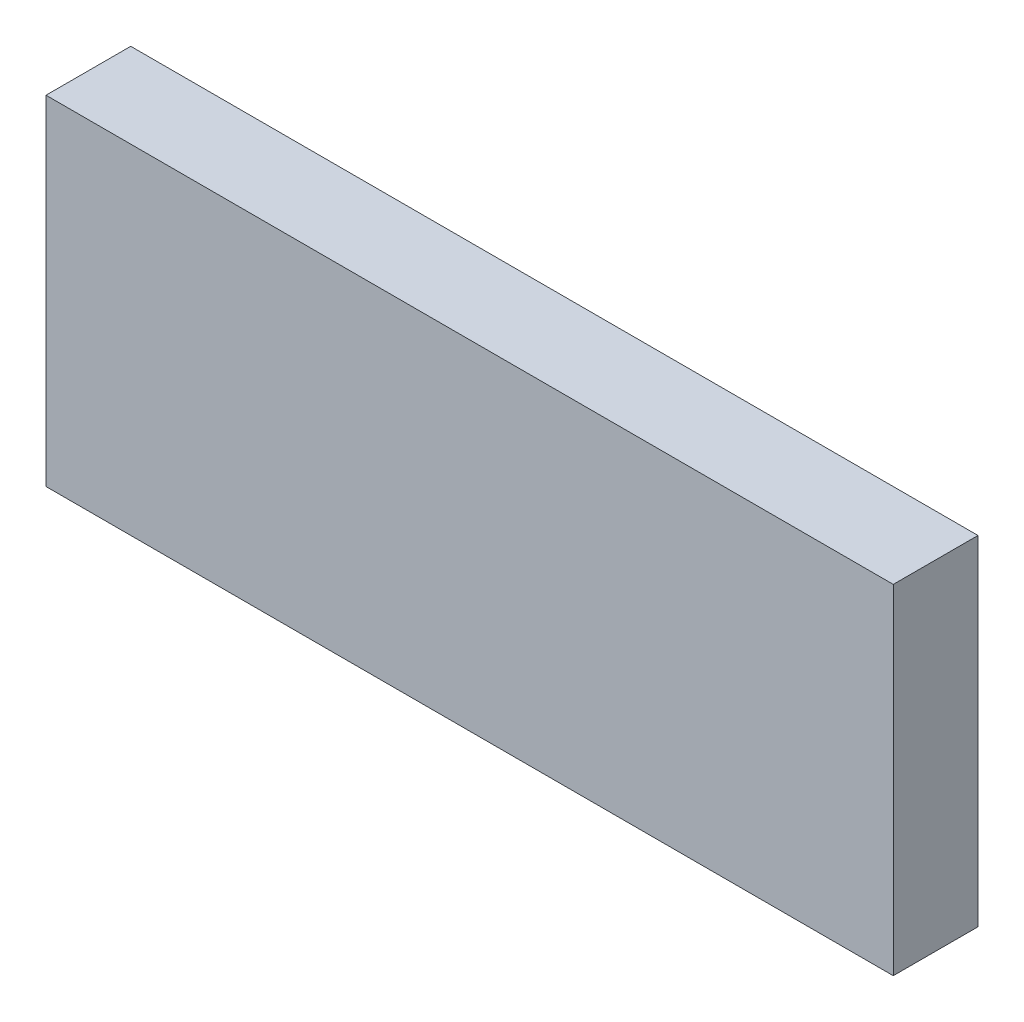
ISO-10303-21;
HEADER;
FILE_DESCRIPTION(('STEP AP214'),'2;1');
FILE_NAME('part.step','',(''),(''),'','','');
FILE_SCHEMA(('AUTOMOTIVE_DESIGN { 1 0 10303 214 1 1 1 1 }'));
ENDSEC;
DATA;
#1=APPLICATION_CONTEXT('core data for automotive mechanical design processes');
#2=APPLICATION_PROTOCOL_DEFINITION('international standard','automotive_design',2000,#1);
#3=PRODUCT_CONTEXT('',#1,'mechanical');
#4=PRODUCT('Part','Part','',(#3));
#5=PRODUCT_RELATED_PRODUCT_CATEGORY('part','',(#4));
#6=PRODUCT_DEFINITION_FORMATION('','',#4);
#7=PRODUCT_DEFINITION_CONTEXT('part definition',#1,'design');
#8=PRODUCT_DEFINITION('design','',#6,#7);
#9=PRODUCT_DEFINITION_SHAPE('','',#8);
#10=(LENGTH_UNIT() NAMED_UNIT(*) SI_UNIT(.MILLI.,.METRE.));
#11=(NAMED_UNIT(*) PLANE_ANGLE_UNIT() SI_UNIT($,.RADIAN.));
#12=(NAMED_UNIT(*) SI_UNIT($,.STERADIAN.) SOLID_ANGLE_UNIT());
#13=UNCERTAINTY_MEASURE_WITH_UNIT(LENGTH_MEASURE(1.E-05),#10,'distance_accuracy_value','');
#14=(GEOMETRIC_REPRESENTATION_CONTEXT(3) GLOBAL_UNCERTAINTY_ASSIGNED_CONTEXT((#13)) GLOBAL_UNIT_ASSIGNED_CONTEXT((#10,
#11,#12)) REPRESENTATION_CONTEXT('',''));
#15=CARTESIAN_POINT('',(0.,0.,0.));
#16=DIRECTION('',(0.,0.,1.));
#17=DIRECTION('',(1.,0.,0.));
#18=AXIS2_PLACEMENT_3D('',#15,#16,#17);
#19=CARTESIAN_POINT('',(50.,-20.,10.));
#20=DIRECTION('',(-1.,0.,0.));
#21=DIRECTION('',(0.,0.,1.));
#22=AXIS2_PLACEMENT_3D('',#19,#20,#21);
#23=PLANE('',#22);
#24=DIRECTION('',(0.,1.,0.));
#25=VECTOR('',#24,1.);
#26=CARTESIAN_POINT('',(50.,-20.,0.));
#27=LINE('',#26,#25);
#28=CARTESIAN_POINT('',(50.,-20.,0.));
#29=VERTEX_POINT('',#28);
#30=CARTESIAN_POINT('',(50.,20.,0.));
#31=VERTEX_POINT('',#30);
#32=EDGE_CURVE('E113',#29,#31,#27,.T.);
#33=ORIENTED_EDGE('',*,*,#32,.T.);
#34=DIRECTION('',(0.,0.,-1.));
#35=VECTOR('',#34,1.);
#36=CARTESIAN_POINT('',(50.,20.,10.));
#37=LINE('',#36,#35);
#38=CARTESIAN_POINT('',(50.,20.,10.));
#39=VERTEX_POINT('',#38);
#40=EDGE_CURVE('E11',#39,#31,#37,.T.);
#41=ORIENTED_EDGE('',*,*,#40,.F.);
#42=DIRECTION('',(0.,1.,0.));
#43=VECTOR('',#42,1.);
#44=CARTESIAN_POINT('',(50.,-20.,10.));
#45=LINE('',#44,#43);
#46=CARTESIAN_POINT('',(50.,-20.,10.));
#47=VERTEX_POINT('',#46);
#48=EDGE_CURVE('E97',#47,#39,#45,.T.);
#49=ORIENTED_EDGE('',*,*,#48,.F.);
#50=DIRECTION('',(0.,0.,-1.));
#51=VECTOR('',#50,1.);
#52=CARTESIAN_POINT('',(50.,-20.,10.));
#53=LINE('',#52,#51);
#54=EDGE_CURVE('E109',#47,#29,#53,.T.);
#55=ORIENTED_EDGE('',*,*,#54,.T.);
#56=EDGE_LOOP('',(#33,#41,#49,#55));
#57=FACE_BOUND('',#56,.T.);
#58=ADVANCED_FACE('F45',(#57),#23,.F.);
#59=CARTESIAN_POINT('',(-50.,20.,10.));
#60=DIRECTION('',(0.,-1.,0.));
#61=DIRECTION('',(0.,0.,-1.));
#62=AXIS2_PLACEMENT_3D('',#59,#60,#61);
#63=PLANE('',#62);
#64=DIRECTION('',(-1.,0.,0.));
#65=VECTOR('',#64,1.);
#66=CARTESIAN_POINT('',(-50.,20.,0.));
#67=LINE('',#66,#65);
#68=CARTESIAN_POINT('',(-50.,20.,0.));
#69=VERTEX_POINT('',#68);
#70=EDGE_CURVE('E102',#31,#69,#67,.T.);
#71=ORIENTED_EDGE('',*,*,#70,.T.);
#72=DIRECTION('',(0.,0.,-1.));
#73=VECTOR('',#72,1.);
#74=CARTESIAN_POINT('',(-50.,20.,10.));
#75=LINE('',#74,#73);
#76=CARTESIAN_POINT('',(-50.,20.,10.));
#77=VERTEX_POINT('',#76);
#78=EDGE_CURVE('E54',#77,#69,#75,.T.);
#79=ORIENTED_EDGE('',*,*,#78,.F.);
#80=DIRECTION('',(-1.,0.,0.));
#81=VECTOR('',#80,1.);
#82=CARTESIAN_POINT('',(-50.,20.,10.));
#83=LINE('',#82,#81);
#84=EDGE_CURVE('E92',#39,#77,#83,.T.);
#85=ORIENTED_EDGE('',*,*,#84,.F.);
#86=ORIENTED_EDGE('',*,*,#40,.T.);
#87=EDGE_LOOP('',(#71,#79,#85,#86));
#88=FACE_BOUND('',#87,.T.);
#89=ADVANCED_FACE('F101',(#88),#63,.F.);
#90=CARTESIAN_POINT('',(-50.,-20.,10.));
#91=DIRECTION('',(1.,0.,0.));
#92=DIRECTION('',(0.,0.,-1.));
#93=AXIS2_PLACEMENT_3D('',#90,#91,#92);
#94=PLANE('',#93);
#95=DIRECTION('',(0.,-1.,0.));
#96=VECTOR('',#95,1.);
#97=CARTESIAN_POINT('',(-50.,-20.,0.));
#98=LINE('',#97,#96);
#99=CARTESIAN_POINT('',(-50.,-20.,0.));
#100=VERTEX_POINT('',#99);
#101=EDGE_CURVE('E79',#69,#100,#98,.T.);
#102=ORIENTED_EDGE('',*,*,#101,.T.);
#103=DIRECTION('',(0.,0.,-1.));
#104=VECTOR('',#103,1.);
#105=CARTESIAN_POINT('',(-50.,-20.,10.));
#106=LINE('',#105,#104);
#107=CARTESIAN_POINT('',(-50.,-20.,10.));
#108=VERTEX_POINT('',#107);
#109=EDGE_CURVE('E104',#108,#100,#106,.T.);
#110=ORIENTED_EDGE('',*,*,#109,.F.);
#111=DIRECTION('',(0.,-1.,0.));
#112=VECTOR('',#111,1.);
#113=CARTESIAN_POINT('',(-50.,-20.,10.));
#114=LINE('',#113,#112);
#115=EDGE_CURVE('E95',#77,#108,#114,.T.);
#116=ORIENTED_EDGE('',*,*,#115,.F.);
#117=ORIENTED_EDGE('',*,*,#78,.T.);
#118=EDGE_LOOP('',(#102,#110,#116,#117));
#119=FACE_BOUND('',#118,.T.);
#120=ADVANCED_FACE('F105',(#119),#94,.F.);
#121=CARTESIAN_POINT('',(-50.,-20.,10.));
#122=DIRECTION('',(0.,1.,0.));
#123=DIRECTION('',(0.,0.,1.));
#124=AXIS2_PLACEMENT_3D('',#121,#122,#123);
#125=PLANE('',#124);
#126=DIRECTION('',(1.,0.,0.));
#127=VECTOR('',#126,1.);
#128=CARTESIAN_POINT('',(-50.,-20.,0.));
#129=LINE('',#128,#127);
#130=EDGE_CURVE('E85',#100,#29,#129,.T.);
#131=ORIENTED_EDGE('',*,*,#130,.T.);
#132=ORIENTED_EDGE('',*,*,#54,.F.);
#133=DIRECTION('',(1.,0.,0.));
#134=VECTOR('',#133,1.);
#135=CARTESIAN_POINT('',(-50.,-20.,10.));
#136=LINE('',#135,#134);
#137=EDGE_CURVE('E62',#108,#47,#136,.T.);
#138=ORIENTED_EDGE('',*,*,#137,.F.);
#139=ORIENTED_EDGE('',*,*,#109,.T.);
#140=EDGE_LOOP('',(#131,#132,#138,#139));
#141=FACE_BOUND('',#140,.T.);
#142=ADVANCED_FACE('F126',(#141),#125,.F.);
#143=CARTESIAN_POINT('',(0.,0.,10.));
#144=DIRECTION('',(0.,0.,-1.));
#145=DIRECTION('',(-1.,0.,0.));
#146=AXIS2_PLACEMENT_3D('',#143,#144,#145);
#147=PLANE('',#146);
#148=ORIENTED_EDGE('',*,*,#48,.T.);
#149=ORIENTED_EDGE('',*,*,#84,.T.);
#150=ORIENTED_EDGE('',*,*,#115,.T.);
#151=ORIENTED_EDGE('',*,*,#137,.T.);
#152=EDGE_LOOP('',(#148,#149,#150,#151));
#153=FACE_BOUND('',#152,.T.);
#154=ADVANCED_FACE('F93',(#153),#147,.F.);
#155=CARTESIAN_POINT('',(0.,0.,0.));
#156=DIRECTION('',(0.,0.,-1.));
#157=DIRECTION('',(-1.,0.,0.));
#158=AXIS2_PLACEMENT_3D('',#155,#156,#157);
#159=PLANE('',#158);
#160=ORIENTED_EDGE('',*,*,#32,.F.);
#161=ORIENTED_EDGE('',*,*,#130,.F.);
#162=ORIENTED_EDGE('',*,*,#101,.F.);
#163=ORIENTED_EDGE('',*,*,#70,.F.);
#164=EDGE_LOOP('',(#160,#161,#162,#163));
#165=FACE_BOUND('',#164,.T.);
#166=ADVANCED_FACE('F129',(#165),#159,.T.);
#167=CLOSED_SHELL('',(#58,#89,#120,#142,#154,#166));
#168=MANIFOLD_SOLID_BREP('B2',#167);
#169=ADVANCED_BREP_SHAPE_REPRESENTATION('',(#18,#168),#14);
#170=SHAPE_DEFINITION_REPRESENTATION(#9,#169);
ENDSEC;
END-ISO-10303-21;
